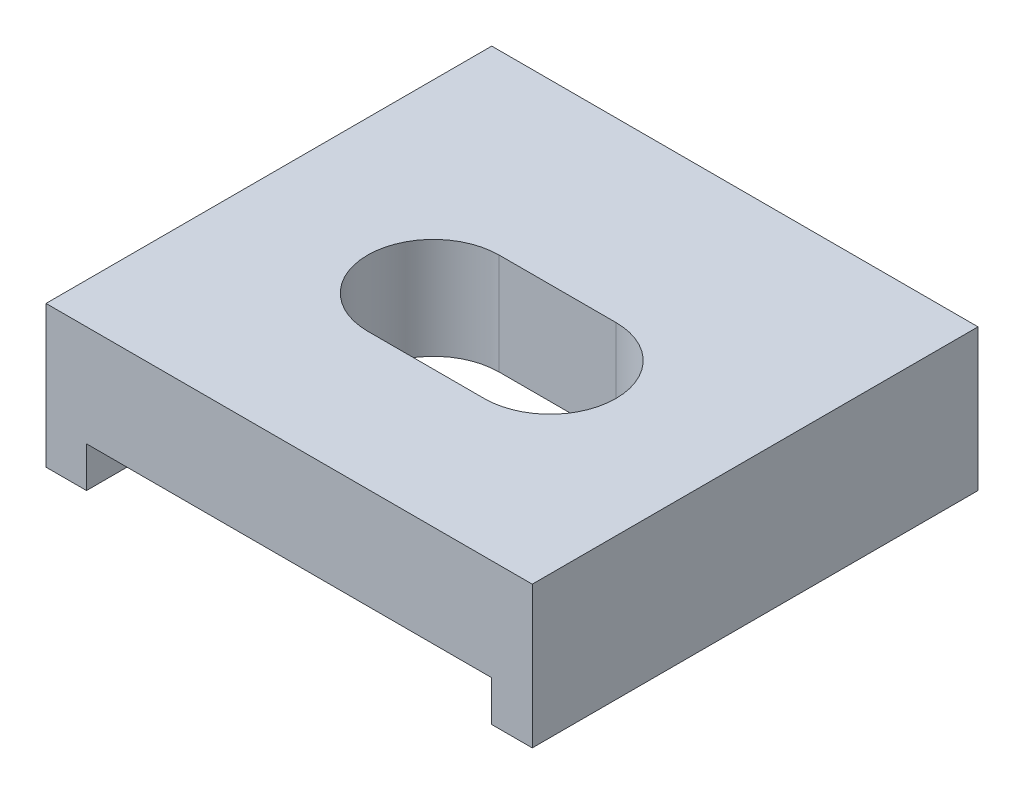
ISO-10303-21;
HEADER;
FILE_DESCRIPTION(('STEP AP214'),'2;1');
FILE_NAME('part.step','',(''),(''),'','','');
FILE_SCHEMA(('AUTOMOTIVE_DESIGN { 1 0 10303 214 1 1 1 1 }'));
ENDSEC;
DATA;
#1=APPLICATION_CONTEXT('core data for automotive mechanical design processes');
#2=APPLICATION_PROTOCOL_DEFINITION('international standard','automotive_design',2000,#1);
#3=PRODUCT_CONTEXT('',#1,'mechanical');
#4=PRODUCT('Part','Part','',(#3));
#5=PRODUCT_RELATED_PRODUCT_CATEGORY('part','',(#4));
#6=PRODUCT_DEFINITION_FORMATION('','',#4);
#7=PRODUCT_DEFINITION_CONTEXT('part definition',#1,'design');
#8=PRODUCT_DEFINITION('design','',#6,#7);
#9=PRODUCT_DEFINITION_SHAPE('','',#8);
#10=(LENGTH_UNIT() NAMED_UNIT(*) SI_UNIT(.MILLI.,.METRE.));
#11=(NAMED_UNIT(*) PLANE_ANGLE_UNIT() SI_UNIT($,.RADIAN.));
#12=(NAMED_UNIT(*) SI_UNIT($,.STERADIAN.) SOLID_ANGLE_UNIT());
#13=UNCERTAINTY_MEASURE_WITH_UNIT(LENGTH_MEASURE(1.E-05),#10,'distance_accuracy_value','');
#14=(GEOMETRIC_REPRESENTATION_CONTEXT(3) GLOBAL_UNCERTAINTY_ASSIGNED_CONTEXT((#13)) GLOBAL_UNIT_ASSIGNED_CONTEXT((#10,
#11,#12)) REPRESENTATION_CONTEXT('',''));
#15=CARTESIAN_POINT('',(0.,0.,0.));
#16=DIRECTION('',(0.,0.,1.));
#17=DIRECTION('',(1.,0.,0.));
#18=AXIS2_PLACEMENT_3D('',#15,#16,#17);
#19=CARTESIAN_POINT('',(0.,2.5,5.));
#20=DIRECTION('',(0.,0.,-1.));
#21=DIRECTION('',(-1.,0.,0.));
#22=AXIS2_PLACEMENT_3D('',#19,#20,#21);
#23=PLANE('',#22);
#24=DIRECTION('',(1.,0.,0.));
#25=VECTOR('',#24,1.);
#26=CARTESIAN_POINT('',(0.,0.,5.));
#27=LINE('',#26,#25);
#28=CARTESIAN_POINT('',(-5.,0.,5.));
#29=VERTEX_POINT('',#28);
#30=CARTESIAN_POINT('',(5.,0.,5.));
#31=VERTEX_POINT('',#30);
#32=EDGE_CURVE('E219',#29,#31,#27,.T.);
#33=ORIENTED_EDGE('',*,*,#32,.T.);
#34=DIRECTION('',(0.,1.,0.));
#35=VECTOR('',#34,1.);
#36=CARTESIAN_POINT('',(5.,-1.,5.));
#37=LINE('',#36,#35);
#38=CARTESIAN_POINT('',(5.,-1.,5.));
#39=VERTEX_POINT('',#38);
#40=EDGE_CURVE('E188',#39,#31,#37,.T.);
#41=ORIENTED_EDGE('',*,*,#40,.F.);
#42=DIRECTION('',(1.,0.,0.));
#43=VECTOR('',#42,1.);
#44=CARTESIAN_POINT('',(5.,-1.,5.));
#45=LINE('',#44,#43);
#46=CARTESIAN_POINT('',(6.,-1.,5.));
#47=VERTEX_POINT('',#46);
#48=EDGE_CURVE('E156',#39,#47,#45,.T.);
#49=ORIENTED_EDGE('',*,*,#48,.T.);
#50=DIRECTION('',(0.,1.,0.));
#51=VECTOR('',#50,1.);
#52=CARTESIAN_POINT('',(6.,-1.,5.));
#53=LINE('',#52,#51);
#54=CARTESIAN_POINT('',(6.,2.5,5.));
#55=VERTEX_POINT('',#54);
#56=EDGE_CURVE('E152',#47,#55,#53,.T.);
#57=ORIENTED_EDGE('',*,*,#56,.T.);
#58=DIRECTION('',(1.,0.,0.));
#59=VECTOR('',#58,1.);
#60=CARTESIAN_POINT('',(0.,2.5,5.));
#61=LINE('',#60,#59);
#62=CARTESIAN_POINT('',(-6.,2.5,5.));
#63=VERTEX_POINT('',#62);
#64=EDGE_CURVE('E201',#63,#55,#61,.T.);
#65=ORIENTED_EDGE('',*,*,#64,.F.);
#66=DIRECTION('',(0.,1.,0.));
#67=VECTOR('',#66,1.);
#68=CARTESIAN_POINT('',(-6.,-1.,5.));
#69=LINE('',#68,#67);
#70=CARTESIAN_POINT('',(-6.,-1.,5.));
#71=VERTEX_POINT('',#70);
#72=EDGE_CURVE('E178',#71,#63,#69,.T.);
#73=ORIENTED_EDGE('',*,*,#72,.F.);
#74=DIRECTION('',(-1.,0.,0.));
#75=VECTOR('',#74,1.);
#76=CARTESIAN_POINT('',(-5.,-1.,5.));
#77=LINE('',#76,#75);
#78=CARTESIAN_POINT('',(-5.,-1.,5.));
#79=VERTEX_POINT('',#78);
#80=EDGE_CURVE('E168',#79,#71,#77,.T.);
#81=ORIENTED_EDGE('',*,*,#80,.F.);
#82=DIRECTION('',(0.,1.,0.));
#83=VECTOR('',#82,1.);
#84=CARTESIAN_POINT('',(-5.,-1.,5.));
#85=LINE('',#84,#83);
#86=EDGE_CURVE('E181',#79,#29,#85,.T.);
#87=ORIENTED_EDGE('',*,*,#86,.T.);
#88=EDGE_LOOP('',(#33,#41,#49,#57,#65,#73,#81,#87));
#89=FACE_BOUND('',#88,.T.);
#90=ADVANCED_FACE('F35',(#89),#23,.F.);
#91=CARTESIAN_POINT('',(-1.44,2.5,0.));
#92=DIRECTION('',(0.,-1.,0.));
#93=DIRECTION('',(0.,0.,-1.));
#94=AXIS2_PLACEMENT_3D('',#91,#92,#93);
#95=CYLINDRICAL_SURFACE('',#94,1.625);
#96=CARTESIAN_POINT('',(-1.44,0.,0.));
#97=DIRECTION('',(0.,1.,0.));
#98=DIRECTION('',(0.,0.,1.));
#99=AXIS2_PLACEMENT_3D('',#96,#97,#98);
#100=CIRCLE('',#99,1.625);
#101=CARTESIAN_POINT('',(-1.44,0.,-1.625));
#102=VERTEX_POINT('',#101);
#103=CARTESIAN_POINT('',(-1.44,0.,1.625));
#104=VERTEX_POINT('',#103);
#105=EDGE_CURVE('E151',#102,#104,#100,.T.);
#106=ORIENTED_EDGE('',*,*,#105,.F.);
#107=DIRECTION('',(0.,-1.,0.));
#108=VECTOR('',#107,1.);
#109=CARTESIAN_POINT('',(-1.44,2.5,-1.625));
#110=LINE('',#109,#108);
#111=CARTESIAN_POINT('',(-1.44,2.5,-1.625));
#112=VERTEX_POINT('',#111);
#113=EDGE_CURVE('E11',#112,#102,#110,.T.);
#114=ORIENTED_EDGE('',*,*,#113,.F.);
#115=CARTESIAN_POINT('',(-1.44,2.5,0.));
#116=DIRECTION('',(0.,1.,0.));
#117=DIRECTION('',(0.,0.,1.));
#118=AXIS2_PLACEMENT_3D('',#115,#116,#117);
#119=CIRCLE('',#118,1.625);
#120=CARTESIAN_POINT('',(-1.44,2.5,1.625));
#121=VERTEX_POINT('',#120);
#122=EDGE_CURVE('E191',#112,#121,#119,.T.);
#123=ORIENTED_EDGE('',*,*,#122,.T.);
#124=DIRECTION('',(0.,-1.,0.));
#125=VECTOR('',#124,1.);
#126=CARTESIAN_POINT('',(-1.44,2.5,1.625));
#127=LINE('',#126,#125);
#128=EDGE_CURVE('E72',#121,#104,#127,.T.);
#129=ORIENTED_EDGE('',*,*,#128,.T.);
#130=EDGE_LOOP('',(#106,#114,#123,#129));
#131=FACE_BOUND('',#130,.T.);
#132=ADVANCED_FACE('F37',(#131),#95,.F.);
#133=CARTESIAN_POINT('',(0.,2.5,-1.625));
#134=DIRECTION('',(0.,0.,1.));
#135=DIRECTION('',(1.,0.,0.));
#136=AXIS2_PLACEMENT_3D('',#133,#134,#135);
#137=PLANE('',#136);
#138=DIRECTION('',(-1.,0.,0.));
#139=VECTOR('',#138,1.);
#140=CARTESIAN_POINT('',(0.,0.,-1.625));
#141=LINE('',#140,#139);
#142=CARTESIAN_POINT('',(1.44,0.,-1.625));
#143=VERTEX_POINT('',#142);
#144=EDGE_CURVE('E205',#143,#102,#141,.T.);
#145=ORIENTED_EDGE('',*,*,#144,.F.);
#146=DIRECTION('',(0.,-1.,0.));
#147=VECTOR('',#146,1.);
#148=CARTESIAN_POINT('',(1.44,2.5,-1.625));
#149=LINE('',#148,#147);
#150=CARTESIAN_POINT('',(1.44,2.5,-1.625));
#151=VERTEX_POINT('',#150);
#152=EDGE_CURVE('E44',#151,#143,#149,.T.);
#153=ORIENTED_EDGE('',*,*,#152,.F.);
#154=DIRECTION('',(-1.,0.,0.));
#155=VECTOR('',#154,1.);
#156=CARTESIAN_POINT('',(0.,2.5,-1.625));
#157=LINE('',#156,#155);
#158=EDGE_CURVE('E193',#151,#112,#157,.T.);
#159=ORIENTED_EDGE('',*,*,#158,.T.);
#160=ORIENTED_EDGE('',*,*,#113,.T.);
#161=EDGE_LOOP('',(#145,#153,#159,#160));
#162=FACE_BOUND('',#161,.T.);
#163=ADVANCED_FACE('F231',(#162),#137,.T.);
#164=CARTESIAN_POINT('',(1.44,2.5,0.));
#165=DIRECTION('',(0.,-1.,0.));
#166=DIRECTION('',(0.,0.,-1.));
#167=AXIS2_PLACEMENT_3D('',#164,#165,#166);
#168=CYLINDRICAL_SURFACE('',#167,1.625);
#169=CARTESIAN_POINT('',(1.44,0.,0.));
#170=DIRECTION('',(0.,1.,0.));
#171=DIRECTION('',(0.,0.,1.));
#172=AXIS2_PLACEMENT_3D('',#169,#170,#171);
#173=CIRCLE('',#172,1.625);
#174=CARTESIAN_POINT('',(1.44,0.,1.625));
#175=VERTEX_POINT('',#174);
#176=EDGE_CURVE('E208',#175,#143,#173,.T.);
#177=ORIENTED_EDGE('',*,*,#176,.F.);
#178=DIRECTION('',(0.,-1.,0.));
#179=VECTOR('',#178,1.);
#180=CARTESIAN_POINT('',(1.44,2.5,1.625));
#181=LINE('',#180,#179);
#182=CARTESIAN_POINT('',(1.44,2.5,1.625));
#183=VERTEX_POINT('',#182);
#184=EDGE_CURVE('E224',#183,#175,#181,.T.);
#185=ORIENTED_EDGE('',*,*,#184,.F.);
#186=CARTESIAN_POINT('',(1.44,2.5,0.));
#187=DIRECTION('',(0.,1.,0.));
#188=DIRECTION('',(0.,0.,1.));
#189=AXIS2_PLACEMENT_3D('',#186,#187,#188);
#190=CIRCLE('',#189,1.625);
#191=EDGE_CURVE('E197',#183,#151,#190,.T.);
#192=ORIENTED_EDGE('',*,*,#191,.T.);
#193=ORIENTED_EDGE('',*,*,#152,.T.);
#194=EDGE_LOOP('',(#177,#185,#192,#193));
#195=FACE_BOUND('',#194,.T.);
#196=ADVANCED_FACE('F228',(#195),#168,.F.);
#197=CARTESIAN_POINT('',(0.,2.5,1.625));
#198=DIRECTION('',(0.,0.,1.));
#199=DIRECTION('',(1.,0.,0.));
#200=AXIS2_PLACEMENT_3D('',#197,#198,#199);
#201=PLANE('',#200);
#202=DIRECTION('',(-1.,0.,0.));
#203=VECTOR('',#202,1.);
#204=CARTESIAN_POINT('',(0.,0.,1.625));
#205=LINE('',#204,#203);
#206=EDGE_CURVE('E211',#175,#104,#205,.T.);
#207=ORIENTED_EDGE('',*,*,#206,.T.);
#208=ORIENTED_EDGE('',*,*,#128,.F.);
#209=DIRECTION('',(-1.,0.,0.));
#210=VECTOR('',#209,1.);
#211=CARTESIAN_POINT('',(0.,2.5,1.625));
#212=LINE('',#211,#210);
#213=EDGE_CURVE('E52',#183,#121,#212,.T.);
#214=ORIENTED_EDGE('',*,*,#213,.F.);
#215=ORIENTED_EDGE('',*,*,#184,.T.);
#216=EDGE_LOOP('',(#207,#208,#214,#215));
#217=FACE_BOUND('',#216,.T.);
#218=ADVANCED_FACE('F237',(#217),#201,.F.);
#219=CARTESIAN_POINT('',(0.,2.5,0.));
#220=DIRECTION('',(0.,1.,0.));
#221=DIRECTION('',(0.,0.,1.));
#222=AXIS2_PLACEMENT_3D('',#219,#220,#221);
#223=PLANE('',#222);
#224=ORIENTED_EDGE('',*,*,#64,.T.);
#225=DIRECTION('',(0.,0.,-1.));
#226=VECTOR('',#225,1.);
#227=CARTESIAN_POINT('',(6.,2.5,5.));
#228=LINE('',#227,#226);
#229=CARTESIAN_POINT('',(6.,2.5,-6.));
#230=VERTEX_POINT('',#229);
#231=EDGE_CURVE('E173',#55,#230,#228,.T.);
#232=ORIENTED_EDGE('',*,*,#231,.T.);
#233=DIRECTION('',(1.,0.,0.));
#234=VECTOR('',#233,1.);
#235=CARTESIAN_POINT('',(-6.,2.5,-6.));
#236=LINE('',#235,#234);
#237=CARTESIAN_POINT('',(-6.,2.5,-6.));
#238=VERTEX_POINT('',#237);
#239=EDGE_CURVE('E147',#238,#230,#236,.T.);
#240=ORIENTED_EDGE('',*,*,#239,.F.);
#241=DIRECTION('',(0.,0.,1.));
#242=VECTOR('',#241,1.);
#243=CARTESIAN_POINT('',(-6.,2.5,-6.));
#244=LINE('',#243,#242);
#245=EDGE_CURVE('E141',#238,#63,#244,.T.);
#246=ORIENTED_EDGE('',*,*,#245,.T.);
#247=EDGE_LOOP('',(#224,#232,#240,#246));
#248=FACE_BOUND('',#247,.T.);
#249=ORIENTED_EDGE('',*,*,#122,.F.);
#250=ORIENTED_EDGE('',*,*,#158,.F.);
#251=ORIENTED_EDGE('',*,*,#191,.F.);
#252=ORIENTED_EDGE('',*,*,#213,.T.);
#253=EDGE_LOOP('',(#249,#250,#251,#252));
#254=FACE_BOUND('',#253,.T.);
#255=ADVANCED_FACE('F238',(#248,#254),#223,.T.);
#256=CARTESIAN_POINT('',(0.,0.,0.));
#257=DIRECTION('',(0.,1.,0.));
#258=DIRECTION('',(0.,0.,1.));
#259=AXIS2_PLACEMENT_3D('',#256,#257,#258);
#260=PLANE('',#259);
#261=ORIENTED_EDGE('',*,*,#105,.T.);
#262=ORIENTED_EDGE('',*,*,#206,.F.);
#263=ORIENTED_EDGE('',*,*,#176,.T.);
#264=ORIENTED_EDGE('',*,*,#144,.T.);
#265=EDGE_LOOP('',(#261,#262,#263,#264));
#266=FACE_BOUND('',#265,.T.);
#267=DIRECTION('',(1.,0.,0.));
#268=VECTOR('',#267,1.);
#269=CARTESIAN_POINT('',(0.,0.,-5.));
#270=LINE('',#269,#268);
#271=CARTESIAN_POINT('',(-5.,0.,-5.));
#272=VERTEX_POINT('',#271);
#273=CARTESIAN_POINT('',(5.,0.,-5.));
#274=VERTEX_POINT('',#273);
#275=EDGE_CURVE('E213',#272,#274,#270,.T.);
#276=ORIENTED_EDGE('',*,*,#275,.T.);
#277=DIRECTION('',(0.,0.,-1.));
#278=VECTOR('',#277,1.);
#279=CARTESIAN_POINT('',(5.,0.,0.));
#280=LINE('',#279,#278);
#281=EDGE_CURVE('E194',#31,#274,#280,.T.);
#282=ORIENTED_EDGE('',*,*,#281,.F.);
#283=ORIENTED_EDGE('',*,*,#32,.F.);
#284=DIRECTION('',(0.,0.,-1.));
#285=VECTOR('',#284,1.);
#286=CARTESIAN_POINT('',(-5.,0.,0.));
#287=LINE('',#286,#285);
#288=EDGE_CURVE('E216',#29,#272,#287,.T.);
#289=ORIENTED_EDGE('',*,*,#288,.T.);
#290=EDGE_LOOP('',(#276,#282,#283,#289));
#291=FACE_BOUND('',#290,.T.);
#292=ADVANCED_FACE('F234',(#266,#291),#260,.F.);
#293=CARTESIAN_POINT('',(5.,-1.,-5.));
#294=DIRECTION('',(-1.,0.,0.));
#295=DIRECTION('',(0.,0.,1.));
#296=AXIS2_PLACEMENT_3D('',#293,#294,#295);
#297=PLANE('',#296);
#298=ORIENTED_EDGE('',*,*,#281,.T.);
#299=DIRECTION('',(0.,1.,0.));
#300=VECTOR('',#299,1.);
#301=CARTESIAN_POINT('',(5.,-1.,-5.));
#302=LINE('',#301,#300);
#303=CARTESIAN_POINT('',(5.,-1.,-5.));
#304=VERTEX_POINT('',#303);
#305=EDGE_CURVE('E185',#304,#274,#302,.T.);
#306=ORIENTED_EDGE('',*,*,#305,.F.);
#307=DIRECTION('',(0.,0.,1.));
#308=VECTOR('',#307,1.);
#309=CARTESIAN_POINT('',(5.,-1.,-5.));
#310=LINE('',#309,#308);
#311=EDGE_CURVE('E158',#304,#39,#310,.T.);
#312=ORIENTED_EDGE('',*,*,#311,.T.);
#313=ORIENTED_EDGE('',*,*,#40,.T.);
#314=EDGE_LOOP('',(#298,#306,#312,#313));
#315=FACE_BOUND('',#314,.T.);
#316=ADVANCED_FACE('F274',(#315),#297,.T.);
#317=CARTESIAN_POINT('',(-5.,-1.,-5.));
#318=DIRECTION('',(0.,0.,1.));
#319=DIRECTION('',(1.,0.,0.));
#320=AXIS2_PLACEMENT_3D('',#317,#318,#319);
#321=PLANE('',#320);
#322=ORIENTED_EDGE('',*,*,#275,.F.);
#323=DIRECTION('',(0.,1.,0.));
#324=VECTOR('',#323,1.);
#325=CARTESIAN_POINT('',(-5.,-1.,-5.));
#326=LINE('',#325,#324);
#327=CARTESIAN_POINT('',(-5.,-1.,-5.));
#328=VERTEX_POINT('',#327);
#329=EDGE_CURVE('E80',#328,#272,#326,.T.);
#330=ORIENTED_EDGE('',*,*,#329,.F.);
#331=DIRECTION('',(1.,0.,0.));
#332=VECTOR('',#331,1.);
#333=CARTESIAN_POINT('',(-5.,-1.,-5.));
#334=LINE('',#333,#332);
#335=EDGE_CURVE('E163',#328,#304,#334,.T.);
#336=ORIENTED_EDGE('',*,*,#335,.T.);
#337=ORIENTED_EDGE('',*,*,#305,.T.);
#338=EDGE_LOOP('',(#322,#330,#336,#337));
#339=FACE_BOUND('',#338,.T.);
#340=ADVANCED_FACE('F280',(#339),#321,.T.);
#341=CARTESIAN_POINT('',(-5.,-1.,5.));
#342=DIRECTION('',(1.,0.,0.));
#343=DIRECTION('',(0.,0.,-1.));
#344=AXIS2_PLACEMENT_3D('',#341,#342,#343);
#345=PLANE('',#344);
#346=ORIENTED_EDGE('',*,*,#288,.F.);
#347=ORIENTED_EDGE('',*,*,#86,.F.);
#348=DIRECTION('',(0.,0.,-1.));
#349=VECTOR('',#348,1.);
#350=CARTESIAN_POINT('',(-5.,-1.,5.));
#351=LINE('',#350,#349);
#352=EDGE_CURVE('E166',#79,#328,#351,.T.);
#353=ORIENTED_EDGE('',*,*,#352,.T.);
#354=ORIENTED_EDGE('',*,*,#329,.T.);
#355=EDGE_LOOP('',(#346,#347,#353,#354));
#356=FACE_BOUND('',#355,.T.);
#357=ADVANCED_FACE('F288',(#356),#345,.T.);
#358=CARTESIAN_POINT('',(-6.,-1.,-6.));
#359=DIRECTION('',(0.,0.,1.));
#360=DIRECTION('',(1.,0.,0.));
#361=AXIS2_PLACEMENT_3D('',#358,#359,#360);
#362=PLANE('',#361);
#363=ORIENTED_EDGE('',*,*,#239,.T.);
#364=DIRECTION('',(0.,1.,0.));
#365=VECTOR('',#364,1.);
#366=CARTESIAN_POINT('',(6.,-1.,-6.));
#367=LINE('',#366,#365);
#368=CARTESIAN_POINT('',(6.,-1.,-6.));
#369=VERTEX_POINT('',#368);
#370=EDGE_CURVE('E144',#369,#230,#367,.T.);
#371=ORIENTED_EDGE('',*,*,#370,.F.);
#372=DIRECTION('',(1.,0.,0.));
#373=VECTOR('',#372,1.);
#374=CARTESIAN_POINT('',(-6.,-1.,-6.));
#375=LINE('',#374,#373);
#376=CARTESIAN_POINT('',(-6.,-1.,-6.));
#377=VERTEX_POINT('',#376);
#378=EDGE_CURVE('E131',#377,#369,#375,.T.);
#379=ORIENTED_EDGE('',*,*,#378,.F.);
#380=DIRECTION('',(0.,1.,0.));
#381=VECTOR('',#380,1.);
#382=CARTESIAN_POINT('',(-6.,-1.,-6.));
#383=LINE('',#382,#381);
#384=EDGE_CURVE('E171',#377,#238,#383,.T.);
#385=ORIENTED_EDGE('',*,*,#384,.T.);
#386=EDGE_LOOP('',(#363,#371,#379,#385));
#387=FACE_BOUND('',#386,.T.);
#388=ADVANCED_FACE('F145',(#387),#362,.F.);
#389=CARTESIAN_POINT('',(6.,-1.,5.));
#390=DIRECTION('',(1.,0.,0.));
#391=DIRECTION('',(0.,0.,-1.));
#392=AXIS2_PLACEMENT_3D('',#389,#390,#391);
#393=PLANE('',#392);
#394=ORIENTED_EDGE('',*,*,#231,.F.);
#395=ORIENTED_EDGE('',*,*,#56,.F.);
#396=DIRECTION('',(0.,0.,-1.));
#397=VECTOR('',#396,1.);
#398=CARTESIAN_POINT('',(6.,-1.,5.));
#399=LINE('',#398,#397);
#400=EDGE_CURVE('E136',#47,#369,#399,.T.);
#401=ORIENTED_EDGE('',*,*,#400,.T.);
#402=ORIENTED_EDGE('',*,*,#370,.T.);
#403=EDGE_LOOP('',(#394,#395,#401,#402));
#404=FACE_BOUND('',#403,.T.);
#405=ADVANCED_FACE('F154',(#404),#393,.T.);
#406=CARTESIAN_POINT('',(-6.,-1.,-6.));
#407=DIRECTION('',(-1.,0.,0.));
#408=DIRECTION('',(0.,0.,1.));
#409=AXIS2_PLACEMENT_3D('',#406,#407,#408);
#410=PLANE('',#409);
#411=ORIENTED_EDGE('',*,*,#245,.F.);
#412=ORIENTED_EDGE('',*,*,#384,.F.);
#413=DIRECTION('',(0.,0.,1.));
#414=VECTOR('',#413,1.);
#415=CARTESIAN_POINT('',(-6.,-1.,-6.));
#416=LINE('',#415,#414);
#417=EDGE_CURVE('E139',#377,#71,#416,.T.);
#418=ORIENTED_EDGE('',*,*,#417,.T.);
#419=ORIENTED_EDGE('',*,*,#72,.T.);
#420=EDGE_LOOP('',(#411,#412,#418,#419));
#421=FACE_BOUND('',#420,.T.);
#422=ADVANCED_FACE('F308',(#421),#410,.T.);
#423=CARTESIAN_POINT('',(0.,-1.,0.));
#424=DIRECTION('',(0.,1.,0.));
#425=DIRECTION('',(0.,0.,1.));
#426=AXIS2_PLACEMENT_3D('',#423,#424,#425);
#427=PLANE('',#426);
#428=ORIENTED_EDGE('',*,*,#378,.T.);
#429=ORIENTED_EDGE('',*,*,#400,.F.);
#430=ORIENTED_EDGE('',*,*,#48,.F.);
#431=ORIENTED_EDGE('',*,*,#311,.F.);
#432=ORIENTED_EDGE('',*,*,#335,.F.);
#433=ORIENTED_EDGE('',*,*,#352,.F.);
#434=ORIENTED_EDGE('',*,*,#80,.T.);
#435=ORIENTED_EDGE('',*,*,#417,.F.);
#436=EDGE_LOOP('',(#428,#429,#430,#431,#432,#433,#434,#435));
#437=FACE_BOUND('',#436,.T.);
#438=ADVANCED_FACE('F133',(#437),#427,.F.);
#439=CLOSED_SHELL('',(#90,#132,#163,#196,#218,#255,#292,#316,#340,#357,#388,#405,#422,#438));
#440=MANIFOLD_SOLID_BREP('B2',#439);
#441=ADVANCED_BREP_SHAPE_REPRESENTATION('',(#18,#440),#14);
#442=SHAPE_DEFINITION_REPRESENTATION(#9,#441);
ENDSEC;
END-ISO-10303-21;
